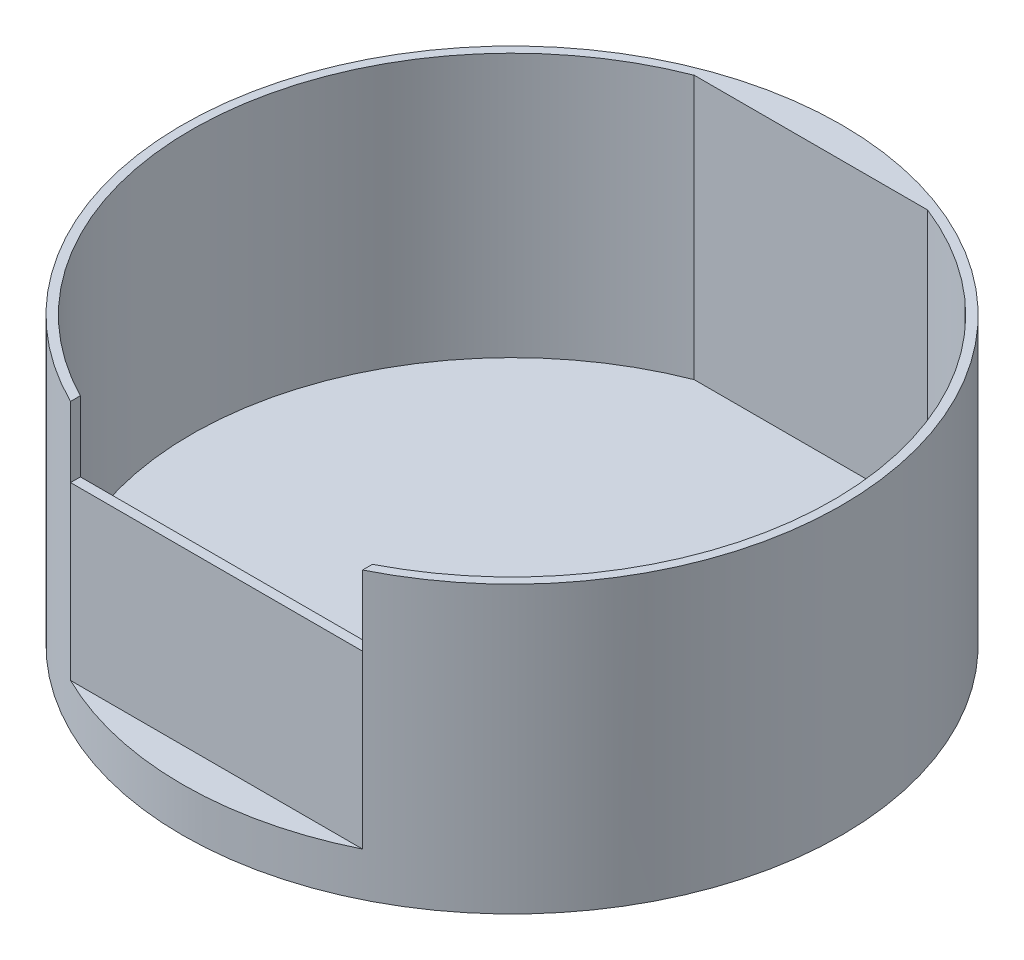
ISO-10303-21;
HEADER;
FILE_DESCRIPTION(('STEP AP214'),'2;1');
FILE_NAME('part.step','',(''),(''),'','','');
FILE_SCHEMA(('AUTOMOTIVE_DESIGN { 1 0 10303 214 1 1 1 1 }'));
ENDSEC;
DATA;
#1=APPLICATION_CONTEXT('core data for automotive mechanical design processes');
#2=APPLICATION_PROTOCOL_DEFINITION('international standard','automotive_design',2000,#1);
#3=PRODUCT_CONTEXT('',#1,'mechanical');
#4=PRODUCT('Part','Part','',(#3));
#5=PRODUCT_RELATED_PRODUCT_CATEGORY('part','',(#4));
#6=PRODUCT_DEFINITION_FORMATION('','',#4);
#7=PRODUCT_DEFINITION_CONTEXT('part definition',#1,'design');
#8=PRODUCT_DEFINITION('design','',#6,#7);
#9=PRODUCT_DEFINITION_SHAPE('','',#8);
#10=(LENGTH_UNIT() NAMED_UNIT(*) SI_UNIT(.MILLI.,.METRE.));
#11=(NAMED_UNIT(*) PLANE_ANGLE_UNIT() SI_UNIT($,.RADIAN.));
#12=(NAMED_UNIT(*) SI_UNIT($,.STERADIAN.) SOLID_ANGLE_UNIT());
#13=UNCERTAINTY_MEASURE_WITH_UNIT(LENGTH_MEASURE(1.E-05),#10,'distance_accuracy_value','');
#14=(GEOMETRIC_REPRESENTATION_CONTEXT(3) GLOBAL_UNCERTAINTY_ASSIGNED_CONTEXT((#13)) GLOBAL_UNIT_ASSIGNED_CONTEXT((#10,
#11,#12)) REPRESENTATION_CONTEXT('',''));
#15=CARTESIAN_POINT('',(0.,0.,0.));
#16=DIRECTION('',(0.,0.,1.));
#17=DIRECTION('',(1.,0.,0.));
#18=AXIS2_PLACEMENT_3D('',#15,#16,#17);
#19=CARTESIAN_POINT('',(0.,65.,0.));
#20=DIRECTION('',(0.,-1.,0.));
#21=DIRECTION('',(0.,0.,-1.));
#22=AXIS2_PLACEMENT_3D('',#19,#20,#21);
#23=CYLINDRICAL_SURFACE('',#22,73.);
#24=CARTESIAN_POINT('',(0.,65.,0.));
#25=DIRECTION('',(0.,1.,0.));
#26=DIRECTION('',(0.,0.,1.));
#27=AXIS2_PLACEMENT_3D('',#24,#25,#26);
#28=CIRCLE('',#27,73.);
#29=CARTESIAN_POINT('',(-26.5518360947036,65.,-68.));
#30=VERTEX_POINT('',#29);
#31=CARTESIAN_POINT('',(-33.2264954516723,65.,65.));
#32=VERTEX_POINT('',#31);
#33=EDGE_CURVE('E179',#30,#32,#28,.T.);
#34=ORIENTED_EDGE('',*,*,#33,.T.);
#35=DIRECTION('',(0.,-1.,0.));
#36=VECTOR('',#35,1.);
#37=CARTESIAN_POINT('',(-33.2264954516723,65.,65.));
#38=LINE('',#37,#36);
#39=CARTESIAN_POINT('',(-33.2264954516723,49.,65.));
#40=VERTEX_POINT('',#39);
#41=EDGE_CURVE('E166',#32,#40,#38,.T.);
#42=ORIENTED_EDGE('',*,*,#41,.T.);
#43=CARTESIAN_POINT('',(-33.2264954516723,5.,65.));
#44=VERTEX_POINT('',#43);
#45=EDGE_CURVE('E165',#40,#44,#38,.T.);
#46=ORIENTED_EDGE('',*,*,#45,.T.);
#47=CARTESIAN_POINT('',(0.,5.,0.));
#48=DIRECTION('',(0.,1.,0.));
#49=DIRECTION('',(0.,0.,1.));
#50=AXIS2_PLACEMENT_3D('',#47,#48,#49);
#51=CIRCLE('',#50,73.);
#52=CARTESIAN_POINT('',(-26.5518360947036,5.,-68.));
#53=VERTEX_POINT('',#52);
#54=EDGE_CURVE('E188',#44,#53,#51,.F.);
#55=ORIENTED_EDGE('',*,*,#54,.T.);
#56=DIRECTION('',(0.,-1.,0.));
#57=VECTOR('',#56,1.);
#58=CARTESIAN_POINT('',(-26.5518360947036,65.,-68.));
#59=LINE('',#58,#57);
#60=EDGE_CURVE('E175',#30,#53,#59,.T.);
#61=ORIENTED_EDGE('',*,*,#60,.F.);
#62=EDGE_LOOP('',(#34,#42,#46,#55,#61));
#63=FACE_BOUND('',#62,.T.);
#64=ADVANCED_FACE('F51',(#63),#23,.F.);
#65=CARTESIAN_POINT('',(26.5518360947036,5.,-68.));
#66=VERTEX_POINT('',#65);
#67=CARTESIAN_POINT('',(33.2264954516723,5.,65.));
#68=VERTEX_POINT('',#67);
#69=EDGE_CURVE('E189',#66,#68,#51,.F.);
#70=ORIENTED_EDGE('',*,*,#69,.T.);
#71=DIRECTION('',(0.,-1.,0.));
#72=VECTOR('',#71,1.);
#73=CARTESIAN_POINT('',(33.2264954516723,65.,65.));
#74=LINE('',#73,#72);
#75=CARTESIAN_POINT('',(33.2264954516723,49.,65.));
#76=VERTEX_POINT('',#75);
#77=EDGE_CURVE('E74',#68,#76,#74,.F.);
#78=ORIENTED_EDGE('',*,*,#77,.T.);
#79=DIRECTION('',(0.,-1.,0.));
#80=VECTOR('',#79,1.);
#81=CARTESIAN_POINT('',(33.2264954516723,65.,65.));
#82=LINE('',#81,#80);
#83=CARTESIAN_POINT('',(33.2264954516723,65.,65.));
#84=VERTEX_POINT('',#83);
#85=EDGE_CURVE('E66',#84,#76,#82,.T.);
#86=ORIENTED_EDGE('',*,*,#85,.F.);
#87=CARTESIAN_POINT('',(26.5518360947036,65.,-68.));
#88=VERTEX_POINT('',#87);
#89=EDGE_CURVE('E178',#84,#88,#28,.T.);
#90=ORIENTED_EDGE('',*,*,#89,.T.);
#91=DIRECTION('',(0.,-1.,0.));
#92=VECTOR('',#91,1.);
#93=CARTESIAN_POINT('',(26.5518360947036,65.,-68.));
#94=LINE('',#93,#92);
#95=EDGE_CURVE('E172',#66,#88,#94,.F.);
#96=ORIENTED_EDGE('',*,*,#95,.F.);
#97=EDGE_LOOP('',(#70,#78,#86,#90,#96));
#98=FACE_BOUND('',#97,.T.);
#99=ADVANCED_FACE('F201',(#98),#23,.F.);
#100=CARTESIAN_POINT('',(0.,5.,0.));
#101=DIRECTION('',(0.,1.,0.));
#102=DIRECTION('',(0.,0.,1.));
#103=AXIS2_PLACEMENT_3D('',#100,#101,#102);
#104=PLANE('',#103);
#105=CARTESIAN_POINT('',(0.,5.,0.));
#106=DIRECTION('',(0.,1.,0.));
#107=DIRECTION('',(0.,0.,1.));
#108=AXIS2_PLACEMENT_3D('',#105,#106,#107);
#109=CIRCLE('',#108,5.);
#110=CARTESIAN_POINT('',(0.,5.,5.));
#111=VERTEX_POINT('',#110);
#112=EDGE_CURVE('E153',#111,#111,#109,.T.);
#113=ORIENTED_EDGE('',*,*,#112,.F.);
#114=EDGE_LOOP('',(#113));
#115=FACE_BOUND('',#114,.T.);
#116=ORIENTED_EDGE('',*,*,#54,.F.);
#117=DIRECTION('',(1.,0.,0.));
#118=VECTOR('',#117,1.);
#119=CARTESIAN_POINT('',(0.,5.,65.));
#120=LINE('',#119,#118);
#121=EDGE_CURVE('E11',#44,#68,#120,.T.);
#122=ORIENTED_EDGE('',*,*,#121,.T.);
#123=ORIENTED_EDGE('',*,*,#69,.F.);
#124=DIRECTION('',(1.,0.,0.));
#125=VECTOR('',#124,1.);
#126=CARTESIAN_POINT('',(0.,5.,-68.));
#127=LINE('',#126,#125);
#128=EDGE_CURVE('E59',#53,#66,#127,.T.);
#129=ORIENTED_EDGE('',*,*,#128,.F.);
#130=EDGE_LOOP('',(#116,#122,#123,#129));
#131=FACE_BOUND('',#130,.T.);
#132=ADVANCED_FACE('F199',(#115,#131),#104,.T.);
#133=CARTESIAN_POINT('',(0.,5.,0.));
#134=DIRECTION('',(0.,-1.,0.));
#135=DIRECTION('',(0.,0.,-1.));
#136=AXIS2_PLACEMENT_3D('',#133,#134,#135);
#137=CYLINDRICAL_SURFACE('',#136,75.);
#138=DIRECTION('',(0.,-1.,0.));
#139=VECTOR('',#138,1.);
#140=CARTESIAN_POINT('',(33.2264954516723,4.99999999999999,67.238381896057));
#141=LINE('',#140,#139);
#142=CARTESIAN_POINT('',(33.2264954516723,49.,67.2383818960569));
#143=VERTEX_POINT('',#142);
#144=CARTESIAN_POINT('',(33.2264954516723,65.,67.2383818960569));
#145=VERTEX_POINT('',#144);
#146=EDGE_CURVE('E136',#143,#145,#141,.F.);
#147=ORIENTED_EDGE('',*,*,#146,.F.);
#148=DIRECTION('',(0.,1.,0.));
#149=VECTOR('',#148,1.);
#150=CARTESIAN_POINT('',(33.2264954516723,10.,67.2383818960569));
#151=LINE('',#150,#149);
#152=CARTESIAN_POINT('',(33.2264954516723,10.,67.2383818960569));
#153=VERTEX_POINT('',#152);
#154=EDGE_CURVE('E129',#153,#143,#151,.T.);
#155=ORIENTED_EDGE('',*,*,#154,.F.);
#156=CARTESIAN_POINT('',(0.,10.,0.));
#157=DIRECTION('',(0.,1.,0.));
#158=DIRECTION('',(0.,0.,1.));
#159=AXIS2_PLACEMENT_3D('',#156,#157,#158);
#160=CIRCLE('',#159,75.);
#161=CARTESIAN_POINT('',(-33.2264954516723,10.,67.2383818960569));
#162=VERTEX_POINT('',#161);
#163=EDGE_CURVE('E118',#162,#153,#160,.T.);
#164=ORIENTED_EDGE('',*,*,#163,.F.);
#165=DIRECTION('',(0.,1.,0.));
#166=VECTOR('',#165,1.);
#167=CARTESIAN_POINT('',(-33.2264954516723,10.,67.2383818960569));
#168=LINE('',#167,#166);
#169=CARTESIAN_POINT('',(-33.2264954516723,49.,67.2383818960569));
#170=VERTEX_POINT('',#169);
#171=EDGE_CURVE('E131',#162,#170,#168,.T.);
#172=ORIENTED_EDGE('',*,*,#171,.T.);
#173=DIRECTION('',(0.,-1.,0.));
#174=VECTOR('',#173,1.);
#175=CARTESIAN_POINT('',(-33.2264954516723,5.,67.2383818960569));
#176=LINE('',#175,#174);
#177=CARTESIAN_POINT('',(-33.2264954516723,65.,67.2383818960569));
#178=VERTEX_POINT('',#177);
#179=EDGE_CURVE('E147',#170,#178,#176,.F.);
#180=ORIENTED_EDGE('',*,*,#179,.T.);
#181=CARTESIAN_POINT('',(0.,65.,0.));
#182=DIRECTION('',(0.,1.,0.));
#183=DIRECTION('',(0.,0.,1.));
#184=AXIS2_PLACEMENT_3D('',#181,#182,#183);
#185=CIRCLE('',#184,75.);
#186=EDGE_CURVE('E182',#145,#178,#185,.T.);
#187=ORIENTED_EDGE('',*,*,#186,.F.);
#188=EDGE_LOOP('',(#147,#155,#164,#172,#180,#187));
#189=FACE_BOUND('',#188,.T.);
#190=CARTESIAN_POINT('',(0.,0.,0.));
#191=DIRECTION('',(0.,1.,0.));
#192=DIRECTION('',(0.,0.,1.));
#193=AXIS2_PLACEMENT_3D('',#190,#191,#192);
#194=CIRCLE('',#193,75.);
#195=CARTESIAN_POINT('',(0.,0.,75.));
#196=VERTEX_POINT('',#195);
#197=EDGE_CURVE('E185',#196,#196,#194,.T.);
#198=ORIENTED_EDGE('',*,*,#197,.T.);
#199=EDGE_LOOP('',(#198));
#200=FACE_BOUND('',#199,.T.);
#201=ADVANCED_FACE('F53',(#189,#200),#137,.T.);
#202=CARTESIAN_POINT('',(0.,0.,0.));
#203=DIRECTION('',(0.,1.,0.));
#204=DIRECTION('',(0.,0.,1.));
#205=AXIS2_PLACEMENT_3D('',#202,#203,#204);
#206=PLANE('',#205);
#207=CARTESIAN_POINT('',(0.,0.,0.));
#208=DIRECTION('',(0.,1.,0.));
#209=DIRECTION('',(0.,0.,1.));
#210=AXIS2_PLACEMENT_3D('',#207,#208,#209);
#211=CIRCLE('',#210,5.);
#212=CARTESIAN_POINT('',(0.,0.,5.));
#213=VERTEX_POINT('',#212);
#214=EDGE_CURVE('E159',#213,#213,#211,.F.);
#215=ORIENTED_EDGE('',*,*,#214,.F.);
#216=EDGE_LOOP('',(#215));
#217=FACE_BOUND('',#216,.T.);
#218=ORIENTED_EDGE('',*,*,#197,.F.);
#219=EDGE_LOOP('',(#218));
#220=FACE_BOUND('',#219,.T.);
#221=ADVANCED_FACE('F230',(#217,#220),#206,.F.);
#222=CARTESIAN_POINT('',(0.,65.,0.));
#223=DIRECTION('',(0.,1.,0.));
#224=DIRECTION('',(0.,0.,1.));
#225=AXIS2_PLACEMENT_3D('',#222,#223,#224);
#226=PLANE('',#225);
#227=DIRECTION('',(0.,0.,-1.));
#228=VECTOR('',#227,1.);
#229=CARTESIAN_POINT('',(33.2264954516723,65.,75.001));
#230=LINE('',#229,#228);
#231=EDGE_CURVE('E151',#145,#84,#230,.T.);
#232=ORIENTED_EDGE('',*,*,#231,.F.);
#233=ORIENTED_EDGE('',*,*,#186,.T.);
#234=DIRECTION('',(0.,0.,-1.));
#235=VECTOR('',#234,1.);
#236=CARTESIAN_POINT('',(-33.2264954516723,65.,75.001));
#237=LINE('',#236,#235);
#238=EDGE_CURVE('E150',#178,#32,#237,.T.);
#239=ORIENTED_EDGE('',*,*,#238,.T.);
#240=ORIENTED_EDGE('',*,*,#33,.F.);
#241=DIRECTION('',(1.,0.,0.));
#242=VECTOR('',#241,1.);
#243=CARTESIAN_POINT('',(0.,65.,-68.));
#244=LINE('',#243,#242);
#245=EDGE_CURVE('E169',#30,#88,#244,.T.);
#246=ORIENTED_EDGE('',*,*,#245,.T.);
#247=ORIENTED_EDGE('',*,*,#89,.F.);
#248=EDGE_LOOP('',(#232,#233,#239,#240,#246,#247));
#249=FACE_BOUND('',#248,.T.);
#250=ADVANCED_FACE('F205',(#249),#226,.T.);
#251=CARTESIAN_POINT('',(0.,-70.4983443527077,-68.));
#252=DIRECTION('',(0.,0.,1.));
#253=DIRECTION('',(1.,0.,0.));
#254=AXIS2_PLACEMENT_3D('',#251,#252,#253);
#255=PLANE('',#254);
#256=ORIENTED_EDGE('',*,*,#245,.F.);
#257=ORIENTED_EDGE('',*,*,#60,.T.);
#258=ORIENTED_EDGE('',*,*,#128,.T.);
#259=ORIENTED_EDGE('',*,*,#95,.T.);
#260=EDGE_LOOP('',(#256,#257,#258,#259));
#261=FACE_BOUND('',#260,.T.);
#262=ADVANCED_FACE('F195',(#261),#255,.T.);
#263=CARTESIAN_POINT('',(0.,-70.4983443527077,65.));
#264=DIRECTION('',(0.,0.,1.));
#265=DIRECTION('',(1.,0.,0.));
#266=AXIS2_PLACEMENT_3D('',#263,#264,#265);
#267=PLANE('',#266);
#268=ORIENTED_EDGE('',*,*,#45,.F.);
#269=DIRECTION('',(-1.,0.,0.));
#270=VECTOR('',#269,1.);
#271=CARTESIAN_POINT('',(33.2264954516723,49.,65.));
#272=LINE('',#271,#270);
#273=EDGE_CURVE('E142',#76,#40,#272,.T.);
#274=ORIENTED_EDGE('',*,*,#273,.F.);
#275=ORIENTED_EDGE('',*,*,#77,.F.);
#276=ORIENTED_EDGE('',*,*,#121,.F.);
#277=EDGE_LOOP('',(#268,#274,#275,#276));
#278=FACE_BOUND('',#277,.T.);
#279=ADVANCED_FACE('F209',(#278),#267,.F.);
#280=CARTESIAN_POINT('',(0.,5.,0.));
#281=DIRECTION('',(0.,1.,0.));
#282=DIRECTION('',(0.,0.,1.));
#283=AXIS2_PLACEMENT_3D('',#280,#281,#282);
#284=CYLINDRICAL_SURFACE('',#283,5.);
#285=ORIENTED_EDGE('',*,*,#214,.T.);
#286=EDGE_LOOP('',(#285));
#287=FACE_BOUND('',#286,.T.);
#288=ORIENTED_EDGE('',*,*,#112,.T.);
#289=EDGE_LOOP('',(#288));
#290=FACE_BOUND('',#289,.T.);
#291=ADVANCED_FACE('F211',(#287,#290),#284,.F.);
#292=CARTESIAN_POINT('',(33.2264954516723,65.,75.001));
#293=DIRECTION('',(1.,0.,0.));
#294=DIRECTION('',(0.,1.,0.));
#295=AXIS2_PLACEMENT_3D('',#292,#293,#294);
#296=PLANE('',#295);
#297=ORIENTED_EDGE('',*,*,#146,.T.);
#298=ORIENTED_EDGE('',*,*,#231,.T.);
#299=ORIENTED_EDGE('',*,*,#85,.T.);
#300=DIRECTION('',(0.,0.,-1.));
#301=VECTOR('',#300,1.);
#302=CARTESIAN_POINT('',(33.2264954516723,49.,75.001));
#303=LINE('',#302,#301);
#304=EDGE_CURVE('E138',#143,#76,#303,.T.);
#305=ORIENTED_EDGE('',*,*,#304,.F.);
#306=EDGE_LOOP('',(#297,#298,#299,#305));
#307=FACE_BOUND('',#306,.T.);
#308=ADVANCED_FACE('F218',(#307),#296,.F.);
#309=CARTESIAN_POINT('',(-33.2264954516723,65.,75.001));
#310=DIRECTION('',(1.,0.,0.));
#311=DIRECTION('',(0.,0.,-1.));
#312=AXIS2_PLACEMENT_3D('',#309,#310,#311);
#313=PLANE('',#312);
#314=DIRECTION('',(0.,0.,-1.));
#315=VECTOR('',#314,1.);
#316=CARTESIAN_POINT('',(-33.2264954516723,49.,75.001));
#317=LINE('',#316,#315);
#318=EDGE_CURVE('E146',#170,#40,#317,.T.);
#319=ORIENTED_EDGE('',*,*,#318,.T.);
#320=ORIENTED_EDGE('',*,*,#41,.F.);
#321=ORIENTED_EDGE('',*,*,#238,.F.);
#322=ORIENTED_EDGE('',*,*,#179,.F.);
#323=EDGE_LOOP('',(#319,#320,#321,#322));
#324=FACE_BOUND('',#323,.T.);
#325=ADVANCED_FACE('F252',(#324),#313,.T.);
#326=CARTESIAN_POINT('',(33.2264954516723,49.,75.001));
#327=DIRECTION('',(0.,-1.,0.));
#328=DIRECTION('',(0.,0.,-1.));
#329=AXIS2_PLACEMENT_3D('',#326,#327,#328);
#330=PLANE('',#329);
#331=ORIENTED_EDGE('',*,*,#318,.F.);
#332=DIRECTION('',(-1.,0.,0.));
#333=VECTOR('',#332,1.);
#334=CARTESIAN_POINT('',(-33.2264954516723,49.,67.2383818960569));
#335=LINE('',#334,#333);
#336=EDGE_CURVE('E125',#143,#170,#335,.T.);
#337=ORIENTED_EDGE('',*,*,#336,.F.);
#338=ORIENTED_EDGE('',*,*,#304,.T.);
#339=ORIENTED_EDGE('',*,*,#273,.T.);
#340=EDGE_LOOP('',(#331,#337,#338,#339));
#341=FACE_BOUND('',#340,.T.);
#342=ADVANCED_FACE('F261',(#341),#330,.F.);
#343=CARTESIAN_POINT('',(-33.2264954516723,10.,67.2383818960569));
#344=DIRECTION('',(0.,0.,-1.));
#345=DIRECTION('',(-1.,0.,0.));
#346=AXIS2_PLACEMENT_3D('',#343,#344,#345);
#347=PLANE('',#346);
#348=ORIENTED_EDGE('',*,*,#336,.T.);
#349=ORIENTED_EDGE('',*,*,#171,.F.);
#350=DIRECTION('',(-1.,0.,0.));
#351=VECTOR('',#350,1.);
#352=CARTESIAN_POINT('',(-33.2264954516723,10.,67.2383818960569));
#353=LINE('',#352,#351);
#354=EDGE_CURVE('E121',#153,#162,#353,.T.);
#355=ORIENTED_EDGE('',*,*,#354,.F.);
#356=ORIENTED_EDGE('',*,*,#154,.T.);
#357=EDGE_LOOP('',(#348,#349,#355,#356));
#358=FACE_BOUND('',#357,.T.);
#359=ADVANCED_FACE('F128',(#358),#347,.F.);
#360=CARTESIAN_POINT('',(0.,10.,0.));
#361=DIRECTION('',(0.,1.,0.));
#362=DIRECTION('',(0.,0.,1.));
#363=AXIS2_PLACEMENT_3D('',#360,#361,#362);
#364=PLANE('',#363);
#365=ORIENTED_EDGE('',*,*,#163,.T.);
#366=ORIENTED_EDGE('',*,*,#354,.T.);
#367=EDGE_LOOP('',(#365,#366));
#368=FACE_BOUND('',#367,.T.);
#369=ADVANCED_FACE('F120',(#368),#364,.T.);
#370=CLOSED_SHELL('',(#64,#99,#132,#201,#221,#250,#262,#279,#291,#308,#325,#342,#359,#369));
#371=MANIFOLD_SOLID_BREP('B2',#370);
#372=ADVANCED_BREP_SHAPE_REPRESENTATION('',(#18,#371),#14);
#373=SHAPE_DEFINITION_REPRESENTATION(#9,#372);
ENDSEC;
END-ISO-10303-21;
